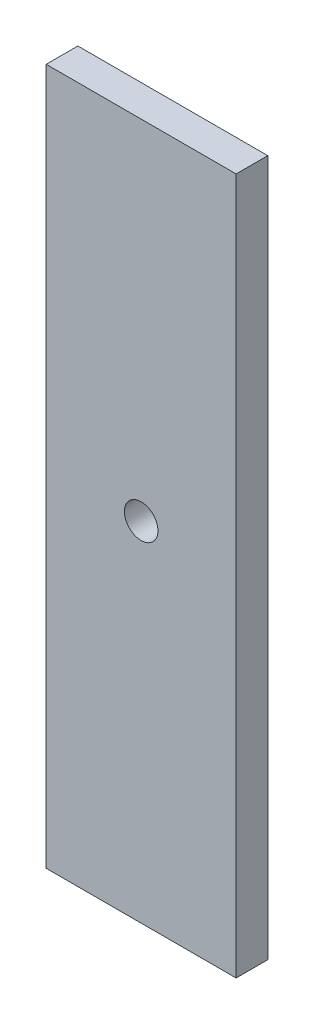
ISO-10303-21;
HEADER;
FILE_DESCRIPTION(('STEP AP214'),'2;1');
FILE_NAME('part.step','',(''),(''),'','','');
FILE_SCHEMA(('AUTOMOTIVE_DESIGN { 1 0 10303 214 1 1 1 1 }'));
ENDSEC;
DATA;
#1=APPLICATION_CONTEXT('core data for automotive mechanical design processes');
#2=APPLICATION_PROTOCOL_DEFINITION('international standard','automotive_design',2000,#1);
#3=PRODUCT_CONTEXT('',#1,'mechanical');
#4=PRODUCT('Part','Part','',(#3));
#5=PRODUCT_RELATED_PRODUCT_CATEGORY('part','',(#4));
#6=PRODUCT_DEFINITION_FORMATION('','',#4);
#7=PRODUCT_DEFINITION_CONTEXT('part definition',#1,'design');
#8=PRODUCT_DEFINITION('design','',#6,#7);
#9=PRODUCT_DEFINITION_SHAPE('','',#8);
#10=(LENGTH_UNIT() NAMED_UNIT(*) SI_UNIT(.MILLI.,.METRE.));
#11=(NAMED_UNIT(*) PLANE_ANGLE_UNIT() SI_UNIT($,.RADIAN.));
#12=(NAMED_UNIT(*) SI_UNIT($,.STERADIAN.) SOLID_ANGLE_UNIT());
#13=UNCERTAINTY_MEASURE_WITH_UNIT(LENGTH_MEASURE(1.E-05),#10,'distance_accuracy_value','');
#14=(GEOMETRIC_REPRESENTATION_CONTEXT(3) GLOBAL_UNCERTAINTY_ASSIGNED_CONTEXT((#13)) GLOBAL_UNIT_ASSIGNED_CONTEXT((#10,
#11,#12)) REPRESENTATION_CONTEXT('',''));
#15=CARTESIAN_POINT('',(0.,0.,0.));
#16=DIRECTION('',(0.,0.,1.));
#17=DIRECTION('',(1.,0.,0.));
#18=AXIS2_PLACEMENT_3D('',#15,#16,#17);
#19=CARTESIAN_POINT('',(0.,0.,6.35));
#20=DIRECTION('',(0.,0.,-1.));
#21=DIRECTION('',(-1.,0.,0.));
#22=AXIS2_PLACEMENT_3D('',#19,#20,#21);
#23=PLANE('',#22);
#24=DIRECTION('',(0.,1.,0.));
#25=VECTOR('',#24,1.);
#26=CARTESIAN_POINT('',(19.05,-69.85,6.35));
#27=LINE('',#26,#25);
#28=CARTESIAN_POINT('',(19.05,-69.85,6.35));
#29=VERTEX_POINT('',#28);
#30=CARTESIAN_POINT('',(19.05,69.85,6.35));
#31=VERTEX_POINT('',#30);
#32=EDGE_CURVE('E92',#29,#31,#27,.T.);
#33=ORIENTED_EDGE('',*,*,#32,.T.);
#34=DIRECTION('',(-1.,0.,0.));
#35=VECTOR('',#34,1.);
#36=CARTESIAN_POINT('',(-19.05,69.85,6.35));
#37=LINE('',#36,#35);
#38=CARTESIAN_POINT('',(-19.05,69.85,6.35));
#39=VERTEX_POINT('',#38);
#40=EDGE_CURVE('E87',#31,#39,#37,.T.);
#41=ORIENTED_EDGE('',*,*,#40,.T.);
#42=DIRECTION('',(0.,-1.,0.));
#43=VECTOR('',#42,1.);
#44=CARTESIAN_POINT('',(-19.05,-69.85,6.35));
#45=LINE('',#44,#43);
#46=CARTESIAN_POINT('',(-19.05,-69.85,6.35));
#47=VERTEX_POINT('',#46);
#48=EDGE_CURVE('E90',#39,#47,#45,.T.);
#49=ORIENTED_EDGE('',*,*,#48,.T.);
#50=DIRECTION('',(1.,0.,0.));
#51=VECTOR('',#50,1.);
#52=CARTESIAN_POINT('',(-19.05,-69.85,6.35));
#53=LINE('',#52,#51);
#54=EDGE_CURVE('E57',#47,#29,#53,.T.);
#55=ORIENTED_EDGE('',*,*,#54,.T.);
#56=EDGE_LOOP('',(#33,#41,#49,#55));
#57=FACE_BOUND('',#56,.T.);
#58=CARTESIAN_POINT('',(0.,0.,6.35));
#59=DIRECTION('',(0.,0.,1.));
#60=DIRECTION('',(1.,0.,0.));
#61=AXIS2_PLACEMENT_3D('',#58,#59,#60);
#62=CIRCLE('',#61,3.3655);
#63=CARTESIAN_POINT('',(3.3655,0.,6.35));
#64=VERTEX_POINT('',#63);
#65=EDGE_CURVE('E112',#64,#64,#62,.T.);
#66=ORIENTED_EDGE('',*,*,#65,.F.);
#67=EDGE_LOOP('',(#66));
#68=FACE_BOUND('',#67,.T.);
#69=ADVANCED_FACE('F39',(#57,#68),#23,.F.);
#70=CARTESIAN_POINT('',(0.,0.,0.));
#71=DIRECTION('',(0.,0.,-1.));
#72=DIRECTION('',(-1.,0.,0.));
#73=AXIS2_PLACEMENT_3D('',#70,#71,#72);
#74=PLANE('',#73);
#75=DIRECTION('',(0.,1.,0.));
#76=VECTOR('',#75,1.);
#77=CARTESIAN_POINT('',(19.05,-69.85,0.));
#78=LINE('',#77,#76);
#79=CARTESIAN_POINT('',(19.05,-69.85,0.));
#80=VERTEX_POINT('',#79);
#81=CARTESIAN_POINT('',(19.05,69.85,0.));
#82=VERTEX_POINT('',#81);
#83=EDGE_CURVE('E108',#80,#82,#78,.T.);
#84=ORIENTED_EDGE('',*,*,#83,.F.);
#85=DIRECTION('',(1.,0.,0.));
#86=VECTOR('',#85,1.);
#87=CARTESIAN_POINT('',(-19.05,-69.85,0.));
#88=LINE('',#87,#86);
#89=CARTESIAN_POINT('',(-19.05,-69.85,0.));
#90=VERTEX_POINT('',#89);
#91=EDGE_CURVE('E80',#90,#80,#88,.T.);
#92=ORIENTED_EDGE('',*,*,#91,.F.);
#93=DIRECTION('',(0.,-1.,0.));
#94=VECTOR('',#93,1.);
#95=CARTESIAN_POINT('',(-19.05,-69.85,0.));
#96=LINE('',#95,#94);
#97=CARTESIAN_POINT('',(-19.05,69.85,0.));
#98=VERTEX_POINT('',#97);
#99=EDGE_CURVE('E74',#98,#90,#96,.T.);
#100=ORIENTED_EDGE('',*,*,#99,.F.);
#101=DIRECTION('',(-1.,0.,0.));
#102=VECTOR('',#101,1.);
#103=CARTESIAN_POINT('',(-19.05,69.85,0.));
#104=LINE('',#103,#102);
#105=EDGE_CURVE('E97',#82,#98,#104,.T.);
#106=ORIENTED_EDGE('',*,*,#105,.F.);
#107=EDGE_LOOP('',(#84,#92,#100,#106));
#108=FACE_BOUND('',#107,.T.);
#109=CARTESIAN_POINT('',(0.,0.,0.));
#110=DIRECTION('',(0.,0.,1.));
#111=DIRECTION('',(1.,0.,0.));
#112=AXIS2_PLACEMENT_3D('',#109,#110,#111);
#113=CIRCLE('',#112,3.3655);
#114=CARTESIAN_POINT('',(3.3655,0.,0.));
#115=VERTEX_POINT('',#114);
#116=EDGE_CURVE('E130',#115,#115,#113,.T.);
#117=ORIENTED_EDGE('',*,*,#116,.T.);
#118=EDGE_LOOP('',(#117));
#119=FACE_BOUND('',#118,.T.);
#120=ADVANCED_FACE('F125',(#108,#119),#74,.T.);
#121=CARTESIAN_POINT('',(19.05,-69.85,6.35));
#122=DIRECTION('',(-1.,0.,0.));
#123=DIRECTION('',(0.,0.,1.));
#124=AXIS2_PLACEMENT_3D('',#121,#122,#123);
#125=PLANE('',#124);
#126=ORIENTED_EDGE('',*,*,#83,.T.);
#127=DIRECTION('',(0.,0.,-1.));
#128=VECTOR('',#127,1.);
#129=CARTESIAN_POINT('',(19.05,69.85,6.35));
#130=LINE('',#129,#128);
#131=EDGE_CURVE('E11',#31,#82,#130,.T.);
#132=ORIENTED_EDGE('',*,*,#131,.F.);
#133=ORIENTED_EDGE('',*,*,#32,.F.);
#134=DIRECTION('',(0.,0.,-1.));
#135=VECTOR('',#134,1.);
#136=CARTESIAN_POINT('',(19.05,-69.85,6.35));
#137=LINE('',#136,#135);
#138=EDGE_CURVE('E104',#29,#80,#137,.T.);
#139=ORIENTED_EDGE('',*,*,#138,.T.);
#140=EDGE_LOOP('',(#126,#132,#133,#139));
#141=FACE_BOUND('',#140,.T.);
#142=ADVANCED_FACE('F41',(#141),#125,.F.);
#143=CARTESIAN_POINT('',(-19.05,69.85,6.35));
#144=DIRECTION('',(0.,-1.,0.));
#145=DIRECTION('',(0.,0.,-1.));
#146=AXIS2_PLACEMENT_3D('',#143,#144,#145);
#147=PLANE('',#146);
#148=ORIENTED_EDGE('',*,*,#105,.T.);
#149=DIRECTION('',(0.,0.,-1.));
#150=VECTOR('',#149,1.);
#151=CARTESIAN_POINT('',(-19.05,69.85,6.35));
#152=LINE('',#151,#150);
#153=EDGE_CURVE('E49',#39,#98,#152,.T.);
#154=ORIENTED_EDGE('',*,*,#153,.F.);
#155=ORIENTED_EDGE('',*,*,#40,.F.);
#156=ORIENTED_EDGE('',*,*,#131,.T.);
#157=EDGE_LOOP('',(#148,#154,#155,#156));
#158=FACE_BOUND('',#157,.T.);
#159=ADVANCED_FACE('F96',(#158),#147,.F.);
#160=CARTESIAN_POINT('',(-19.05,-69.85,6.35));
#161=DIRECTION('',(1.,0.,0.));
#162=DIRECTION('',(0.,0.,-1.));
#163=AXIS2_PLACEMENT_3D('',#160,#161,#162);
#164=PLANE('',#163);
#165=ORIENTED_EDGE('',*,*,#99,.T.);
#166=DIRECTION('',(0.,0.,-1.));
#167=VECTOR('',#166,1.);
#168=CARTESIAN_POINT('',(-19.05,-69.85,6.35));
#169=LINE('',#168,#167);
#170=EDGE_CURVE('E99',#47,#90,#169,.T.);
#171=ORIENTED_EDGE('',*,*,#170,.F.);
#172=ORIENTED_EDGE('',*,*,#48,.F.);
#173=ORIENTED_EDGE('',*,*,#153,.T.);
#174=EDGE_LOOP('',(#165,#171,#172,#173));
#175=FACE_BOUND('',#174,.T.);
#176=ADVANCED_FACE('F100',(#175),#164,.F.);
#177=CARTESIAN_POINT('',(-19.05,-69.85,6.35));
#178=DIRECTION('',(0.,1.,0.));
#179=DIRECTION('',(0.,0.,1.));
#180=AXIS2_PLACEMENT_3D('',#177,#178,#179);
#181=PLANE('',#180);
#182=ORIENTED_EDGE('',*,*,#91,.T.);
#183=ORIENTED_EDGE('',*,*,#138,.F.);
#184=ORIENTED_EDGE('',*,*,#54,.F.);
#185=ORIENTED_EDGE('',*,*,#170,.T.);
#186=EDGE_LOOP('',(#182,#183,#184,#185));
#187=FACE_BOUND('',#186,.T.);
#188=ADVANCED_FACE('F122',(#187),#181,.F.);
#189=CARTESIAN_POINT('',(0.,0.,6.35));
#190=DIRECTION('',(0.,0.,-1.));
#191=DIRECTION('',(-1.,0.,0.));
#192=AXIS2_PLACEMENT_3D('',#189,#190,#191);
#193=CYLINDRICAL_SURFACE('',#192,3.3655);
#194=ORIENTED_EDGE('',*,*,#65,.T.);
#195=EDGE_LOOP('',(#194));
#196=FACE_BOUND('',#195,.T.);
#197=ORIENTED_EDGE('',*,*,#116,.F.);
#198=EDGE_LOOP('',(#197));
#199=FACE_BOUND('',#198,.T.);
#200=ADVANCED_FACE('F138',(#196,#199),#193,.F.);
#201=CLOSED_SHELL('',(#69,#120,#142,#159,#176,#188,#200));
#202=MANIFOLD_SOLID_BREP('B2',#201);
#203=ADVANCED_BREP_SHAPE_REPRESENTATION('',(#18,#202),#14);
#204=SHAPE_DEFINITION_REPRESENTATION(#9,#203);
ENDSEC;
END-ISO-10303-21;
